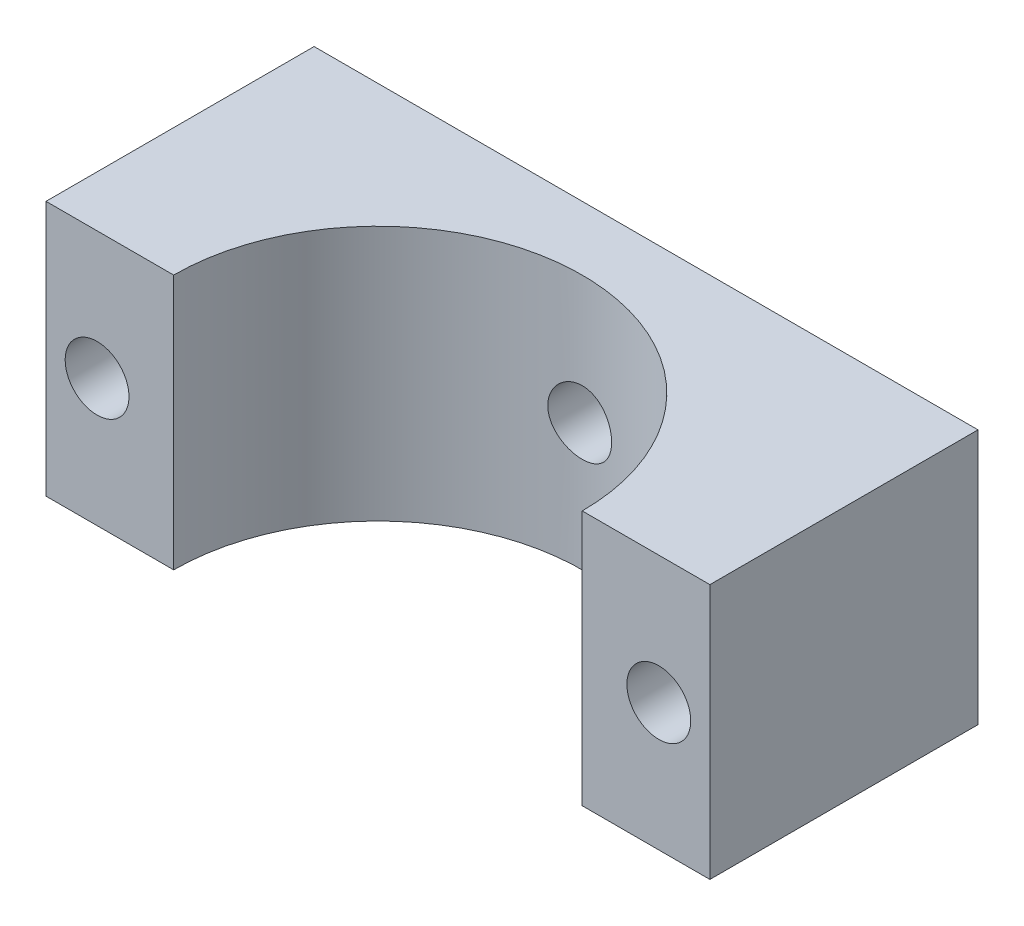
ISO-10303-21;
HEADER;
FILE_DESCRIPTION(('STEP AP214'),'2;1');
FILE_NAME('part.step','',(''),(''),'','','');
FILE_SCHEMA(('AUTOMOTIVE_DESIGN { 1 0 10303 214 1 1 1 1 }'));
ENDSEC;
DATA;
#1=APPLICATION_CONTEXT('core data for automotive mechanical design processes');
#2=APPLICATION_PROTOCOL_DEFINITION('international standard','automotive_design',2000,#1);
#3=PRODUCT_CONTEXT('',#1,'mechanical');
#4=PRODUCT('Part','Part','',(#3));
#5=PRODUCT_RELATED_PRODUCT_CATEGORY('part','',(#4));
#6=PRODUCT_DEFINITION_FORMATION('','',#4);
#7=PRODUCT_DEFINITION_CONTEXT('part definition',#1,'design');
#8=PRODUCT_DEFINITION('design','',#6,#7);
#9=PRODUCT_DEFINITION_SHAPE('','',#8);
#10=(LENGTH_UNIT() NAMED_UNIT(*) SI_UNIT(.MILLI.,.METRE.));
#11=(NAMED_UNIT(*) PLANE_ANGLE_UNIT() SI_UNIT($,.RADIAN.));
#12=(NAMED_UNIT(*) SI_UNIT($,.STERADIAN.) SOLID_ANGLE_UNIT());
#13=UNCERTAINTY_MEASURE_WITH_UNIT(LENGTH_MEASURE(1.E-05),#10,'distance_accuracy_value','');
#14=(GEOMETRIC_REPRESENTATION_CONTEXT(3) GLOBAL_UNCERTAINTY_ASSIGNED_CONTEXT((#13)) GLOBAL_UNIT_ASSIGNED_CONTEXT((#10,
#11,#12)) REPRESENTATION_CONTEXT('',''));
#15=CARTESIAN_POINT('',(0.,0.,0.));
#16=DIRECTION('',(0.,0.,1.));
#17=DIRECTION('',(1.,0.,0.));
#18=AXIS2_PLACEMENT_3D('',#15,#16,#17);
#19=CARTESIAN_POINT('',(0.,10.,0.));
#20=DIRECTION('',(0.,-1.,0.));
#21=DIRECTION('',(0.,0.,-1.));
#22=AXIS2_PLACEMENT_3D('',#19,#20,#21);
#23=CYLINDRICAL_SURFACE('',#22,8.);
#24=CARTESIAN_POINT('',(0.,6.25,-8.));
#25=CARTESIAN_POINT('',(0.0697575486355164,6.24999715086424,-7.99999885097242));
#26=CARTESIAN_POINT('',(0.139554702432852,6.24414094311322,-7.9990780624287));
#27=CARTESIAN_POINT('',(0.277195657489051,6.22087815436162,-7.99549349048796));
#28=CARTESIAN_POINT('',(0.345037530661658,6.20346055374825,-7.99282804422361));
#29=CARTESIAN_POINT('',(0.476756269023702,6.15761016859669,-7.98605348582888));
#30=CARTESIAN_POINT('',(0.540636176144951,6.1291859593192,-7.98194549781586));
#31=CARTESIAN_POINT('',(0.6627106255223,6.0621507274292,-7.97273897019077));
#32=CARTESIAN_POINT('',(0.720905905184154,6.02354102848203,-7.96764055931276));
#33=CARTESIAN_POINT('',(0.830459955825809,5.93688347582302,-7.95697134207178));
#34=CARTESIAN_POINT('',(0.881763739571322,5.88876650255488,-7.95139725696168));
#35=CARTESIAN_POINT('',(0.975603844114116,5.78460902586555,-7.94043038065143));
#36=CARTESIAN_POINT('',(1.01813964327096,5.7285680513499,-7.93503760025374));
#37=CARTESIAN_POINT('',(1.09345272164442,5.60978086432814,-7.92501214063723));
#38=CARTESIAN_POINT('',(1.12617636778996,5.5470002588191,-7.92038369893052));
#39=CARTESIAN_POINT('',(1.18059340798533,5.4167492945711,-7.91245600871182));
#40=CARTESIAN_POINT('',(1.20228745505032,5.34927921374472,-7.90915668151108));
#41=CARTESIAN_POINT('',(1.23385779661084,5.21214454942811,-7.90429317255518));
#42=CARTESIAN_POINT('',(1.24382852743748,5.1425022070906,-7.90271513266182));
#43=CARTESIAN_POINT('',(1.25196184878811,5.00251640555368,-7.90143085535887));
#44=CARTESIAN_POINT('',(1.25012517430233,4.93217299026698,-7.90172450144011));
#45=CARTESIAN_POINT('',(1.23477290404445,4.79345148407366,-7.90413775227603));
#46=CARTESIAN_POINT('',(1.22136281479847,4.72506138832343,-7.90624086092473));
#47=CARTESIAN_POINT('',(1.18340968916876,4.59151399682034,-7.91201028172736));
#48=CARTESIAN_POINT('',(1.15886631342066,4.52635679967973,-7.91567664153206));
#49=CARTESIAN_POINT('',(1.09923458474692,4.40080564366142,-7.92417753427311));
#50=CARTESIAN_POINT('',(1.06410186157774,4.34043310411347,-7.92901696543622));
#51=CARTESIAN_POINT('',(0.984320290733186,4.22640023215723,-7.93931523075049));
#52=CARTESIAN_POINT('',(0.939670766265083,4.17274037755627,-7.94477410894106));
#53=CARTESIAN_POINT('',(0.841545444111664,4.07304487668334,-7.95576893124448));
#54=CARTESIAN_POINT('',(0.787979002802695,4.02709842086527,-7.96130506817796));
#55=CARTESIAN_POINT('',(0.67384847368968,3.94483342718005,-7.97177562673913));
#56=CARTESIAN_POINT('',(0.613284350340659,3.90851493822159,-7.97671004531012));
#57=CARTESIAN_POINT('',(0.486797963528246,3.8465309632888,-7.98542699513518));
#58=CARTESIAN_POINT('',(0.42087209312023,3.8208727207335,-7.98920874270967));
#59=CARTESIAN_POINT('',(0.28557476734838,3.78101701627639,-7.99518780000339));
#60=CARTESIAN_POINT('',(0.2162035653436,3.76681871296676,-7.99738522604488));
#61=CARTESIAN_POINT('',(0.076754168381868,3.7504053617749,-7.99993255863639));
#62=CARTESIAN_POINT('',(0.00669073075435144,3.74806776051191,-8.0003013589643));
#63=CARTESIAN_POINT('',(-0.132827273205821,3.75511635266799,-7.99920143245634));
#64=CARTESIAN_POINT('',(-0.202281859962578,3.76450215129455,-7.99773276749821));
#65=CARTESIAN_POINT('',(-0.338236723132852,3.79462919384009,-7.99313461846611));
#66=CARTESIAN_POINT('',(-0.404750631028021,3.81531037913387,-7.99001392107693));
#67=CARTESIAN_POINT('',(-0.533367033928313,3.86737754719939,-7.98246037841779));
#68=CARTESIAN_POINT('',(-0.595469306519704,3.89876406922133,-7.97802746705036));
#69=CARTESIAN_POINT('',(-0.714036101125204,3.97163599556329,-7.96829486370472));
#70=CARTESIAN_POINT('',(-0.770452561891862,4.01319871004524,-7.9629886433171));
#71=CARTESIAN_POINT('',(-0.875553482539031,4.10513604295389,-7.95211940232218));
#72=CARTESIAN_POINT('',(-0.924237452235089,4.15551121960243,-7.94655636546338));
#73=CARTESIAN_POINT('',(-1.01294040388345,4.2641905986086,-7.93574013768325));
#74=CARTESIAN_POINT('',(-1.05287699292063,4.32256242356116,-7.93049020595401));
#75=CARTESIAN_POINT('',(-1.1223778386332,4.44525803683067,-7.92095346402914));
#76=CARTESIAN_POINT('',(-1.15194239389052,4.50958165374474,-7.91666662610998));
#77=CARTESIAN_POINT('',(-1.19973385972497,4.64211482035709,-7.90956535676178));
#78=CARTESIAN_POINT('',(-1.21800327473956,4.71030873438281,-7.9067454117448));
#79=CARTESIAN_POINT('',(-1.24282061020268,4.84884457183199,-7.90288285140397));
#80=CARTESIAN_POINT('',(-1.24936941542499,4.9191863327095,-7.9018401019222));
#81=CARTESIAN_POINT('',(-1.25053726345378,5.05919935795374,-7.90165529022442));
#82=CARTESIAN_POINT('',(-1.24528590274213,5.12886954846675,-7.90249258021451));
#83=CARTESIAN_POINT('',(-1.2232811162795,5.26632264857214,-7.90592849470915));
#84=CARTESIAN_POINT('',(-1.20652771543481,5.33410556225086,-7.90852711539975));
#85=CARTESIAN_POINT('',(-1.16204164945926,5.46581891332026,-7.91518544427452));
#86=CARTESIAN_POINT('',(-1.1343188086929,5.52975273912921,-7.91924384476704));
#87=CARTESIAN_POINT('',(-1.06869384273209,5.65208280683814,-7.92836592023698));
#88=CARTESIAN_POINT('',(-1.03079131410443,5.71047882914422,-7.93342963505413));
#89=CARTESIAN_POINT('',(-0.945415040695398,5.82073277206342,-7.9440578404613));
#90=CARTESIAN_POINT('',(-0.897845535473842,5.87251609830692,-7.94962700580145));
#91=CARTESIAN_POINT('',(-0.79468797319102,5.96741061819337,-7.96060021820367));
#92=CARTESIAN_POINT('',(-0.739098060392162,6.01051979929594,-7.96600422670061));
#93=CARTESIAN_POINT('',(-0.621083429421707,6.08707561151578,-7.9760755122835));
#94=CARTESIAN_POINT('',(-0.55861968607119,6.12046268637981,-7.98073817215134));
#95=CARTESIAN_POINT('',(-0.428925941178892,6.17622049809647,-7.9887562991944));
#96=CARTESIAN_POINT('',(-0.361700888290881,6.1986024862792,-7.9921131007106));
#97=CARTESIAN_POINT('',(-0.245157119955797,6.22671651054529,-7.9963872293244));
#98=CARTESIAN_POINT('',(-0.196552787825812,6.2354342453145,-7.99773495813061));
#99=CARTESIAN_POINT('',(-0.0986388989252906,6.24707695668954,-7.99954174348811));
#100=CARTESIAN_POINT('',(-0.0493293520845591,6.25000201477867,-8.00000081253982));
#101=CARTESIAN_POINT('',(0.,6.25,-8.));
#102=B_SPLINE_CURVE_WITH_KNOTS('',3,(#24,#25,#26,#27,#28,#29,#30,#31,#32,#33,#34,#35,#36,#37,
#38,#39,#40,#41,#42,#43,#44,#45,#46,#47,#48,#49,#50,#51,#52,#53,#54,#55,#56,#57,#58,#59,#60,#61,
#62,#63,#64,#65,#66,#67,#68,#69,#70,#71,#72,#73,#74,#75,#76,#77,#78,#79,#80,#81,#82,#83,#84,#85,
#86,#87,#88,#89,#90,#91,#92,#93,#94,#95,#96,#97,#98,#99,#100,#101),.UNSPECIFIED.,.T.,.F.,(4,2,2,
2,2,2,2,2,2,2,2,2,2,2,2,2,2,2,2,2,2,2,2,2,2,2,2,2,2,2,2,2,2,2,2,2,2,2,4),(0.,0.209092370238745,
0.418384321264007,0.627513539720514,0.83661559396015,1.047297840761,1.25799261822711,
1.4698188930288,1.68163262504619,1.89172815567497,2.10181060835272,2.3099978801129,
2.51819149825525,2.72726988701174,2.93636314946034,3.14772866167183,3.35909524756914,
3.57060521877282,3.78209965914933,3.99140427002957,4.20070183264178,4.40889722378283,
4.61710310371015,4.82694270734836,5.03679560800708,5.24854740124796,5.46029309824491,
5.67123705197566,5.88216508114648,6.09078790799346,6.29941028309448,6.50784623483309,
6.71629044835674,6.92691006157771,7.1375784857115,7.34951152099921,7.5612274282814,
7.7090900817577,7.85695065529355),.UNSPECIFIED.);
#103=CARTESIAN_POINT('',(0.,6.25,-8.));
#104=VERTEX_POINT('',#103);
#105=EDGE_CURVE('E168',#104,#104,#102,.T.);
#106=ORIENTED_EDGE('',*,*,#105,.T.);
#107=EDGE_LOOP('',(#106));
#108=FACE_BOUND('',#107,.T.);
#109=CARTESIAN_POINT('',(0.,0.,0.));
#110=DIRECTION('',(0.,-1.,0.));
#111=DIRECTION('',(0.,0.,1.));
#112=AXIS2_PLACEMENT_3D('',#109,#110,#111);
#113=CIRCLE('',#112,8.);
#114=CARTESIAN_POINT('',(-8.,0.,0.));
#115=VERTEX_POINT('',#114);
#116=CARTESIAN_POINT('',(8.,0.,0.));
#117=VERTEX_POINT('',#116);
#118=EDGE_CURVE('E122',#115,#117,#113,.T.);
#119=ORIENTED_EDGE('',*,*,#118,.T.);
#120=DIRECTION('',(0.,-1.,0.));
#121=VECTOR('',#120,1.);
#122=CARTESIAN_POINT('',(8.,10.,0.));
#123=LINE('',#122,#121);
#124=CARTESIAN_POINT('',(8.,10.,0.));
#125=VERTEX_POINT('',#124);
#126=EDGE_CURVE('E11',#125,#117,#123,.T.);
#127=ORIENTED_EDGE('',*,*,#126,.F.);
#128=CARTESIAN_POINT('',(0.,10.,0.));
#129=DIRECTION('',(0.,-1.,0.));
#130=DIRECTION('',(0.,0.,1.));
#131=AXIS2_PLACEMENT_3D('',#128,#129,#130);
#132=CIRCLE('',#131,8.);
#133=CARTESIAN_POINT('',(-8.,10.,0.));
#134=VERTEX_POINT('',#133);
#135=EDGE_CURVE('E133',#134,#125,#132,.T.);
#136=ORIENTED_EDGE('',*,*,#135,.F.);
#137=DIRECTION('',(0.,-1.,0.));
#138=VECTOR('',#137,1.);
#139=CARTESIAN_POINT('',(-8.,10.,0.));
#140=LINE('',#139,#138);
#141=EDGE_CURVE('E118',#134,#115,#140,.T.);
#142=ORIENTED_EDGE('',*,*,#141,.T.);
#143=EDGE_LOOP('',(#119,#127,#136,#142));
#144=FACE_BOUND('',#143,.T.);
#145=ADVANCED_FACE('F36',(#108,#144),#23,.F.);
#146=CARTESIAN_POINT('',(8.,10.,0.));
#147=DIRECTION('',(0.,0.,-1.));
#148=DIRECTION('',(-1.,0.,0.));
#149=AXIS2_PLACEMENT_3D('',#146,#147,#148);
#150=PLANE('',#149);
#151=CARTESIAN_POINT('',(11.,5.,0.));
#152=DIRECTION('',(0.,0.,-1.));
#153=DIRECTION('',(-1.,0.,0.));
#154=AXIS2_PLACEMENT_3D('',#151,#152,#153);
#155=CIRCLE('',#154,1.25);
#156=CARTESIAN_POINT('',(9.75,5.,0.));
#157=VERTEX_POINT('',#156);
#158=EDGE_CURVE('E126',#157,#157,#155,.T.);
#159=ORIENTED_EDGE('',*,*,#158,.T.);
#160=EDGE_LOOP('',(#159));
#161=FACE_BOUND('',#160,.T.);
#162=DIRECTION('',(1.,0.,0.));
#163=VECTOR('',#162,1.);
#164=CARTESIAN_POINT('',(8.,0.,0.));
#165=LINE('',#164,#163);
#166=CARTESIAN_POINT('',(13.,0.,0.));
#167=VERTEX_POINT('',#166);
#168=EDGE_CURVE('E125',#117,#167,#165,.T.);
#169=ORIENTED_EDGE('',*,*,#168,.T.);
#170=DIRECTION('',(0.,-1.,0.));
#171=VECTOR('',#170,1.);
#172=CARTESIAN_POINT('',(13.,10.,0.));
#173=LINE('',#172,#171);
#174=CARTESIAN_POINT('',(13.,10.,0.));
#175=VERTEX_POINT('',#174);
#176=EDGE_CURVE('E46',#175,#167,#173,.T.);
#177=ORIENTED_EDGE('',*,*,#176,.F.);
#178=DIRECTION('',(1.,0.,0.));
#179=VECTOR('',#178,1.);
#180=CARTESIAN_POINT('',(8.,10.,0.));
#181=LINE('',#180,#179);
#182=EDGE_CURVE('E91',#125,#175,#181,.T.);
#183=ORIENTED_EDGE('',*,*,#182,.F.);
#184=ORIENTED_EDGE('',*,*,#126,.T.);
#185=EDGE_LOOP('',(#169,#177,#183,#184));
#186=FACE_BOUND('',#185,.T.);
#187=ADVANCED_FACE('F160',(#161,#186),#150,.F.);
#188=CARTESIAN_POINT('',(13.,10.,0.));
#189=DIRECTION('',(-1.,0.,0.));
#190=DIRECTION('',(0.,0.,1.));
#191=AXIS2_PLACEMENT_3D('',#188,#189,#190);
#192=PLANE('',#191);
#193=DIRECTION('',(0.,0.,-1.));
#194=VECTOR('',#193,1.);
#195=CARTESIAN_POINT('',(13.,0.,0.));
#196=LINE('',#195,#194);
#197=CARTESIAN_POINT('',(13.,0.,-10.5));
#198=VERTEX_POINT('',#197);
#199=EDGE_CURVE('E128',#167,#198,#196,.T.);
#200=ORIENTED_EDGE('',*,*,#199,.T.);
#201=DIRECTION('',(0.,-1.,0.));
#202=VECTOR('',#201,1.);
#203=CARTESIAN_POINT('',(13.,10.,-10.5));
#204=LINE('',#203,#202);
#205=CARTESIAN_POINT('',(13.,10.,-10.5));
#206=VERTEX_POINT('',#205);
#207=EDGE_CURVE('E113',#206,#198,#204,.T.);
#208=ORIENTED_EDGE('',*,*,#207,.F.);
#209=DIRECTION('',(0.,0.,-1.));
#210=VECTOR('',#209,1.);
#211=CARTESIAN_POINT('',(13.,10.,0.));
#212=LINE('',#211,#210);
#213=EDGE_CURVE('E104',#175,#206,#212,.T.);
#214=ORIENTED_EDGE('',*,*,#213,.F.);
#215=ORIENTED_EDGE('',*,*,#176,.T.);
#216=EDGE_LOOP('',(#200,#208,#214,#215));
#217=FACE_BOUND('',#216,.T.);
#218=ADVANCED_FACE('F140',(#217),#192,.F.);
#219=CARTESIAN_POINT('',(-13.,10.,-10.5));
#220=DIRECTION('',(0.,0.,1.));
#221=DIRECTION('',(1.,0.,0.));
#222=AXIS2_PLACEMENT_3D('',#219,#220,#221);
#223=PLANE('',#222);
#224=CARTESIAN_POINT('',(11.,5.,-10.5));
#225=DIRECTION('',(0.,0.,-1.));
#226=DIRECTION('',(-1.,0.,0.));
#227=AXIS2_PLACEMENT_3D('',#224,#225,#226);
#228=CIRCLE('',#227,1.25);
#229=CARTESIAN_POINT('',(9.75,5.,-10.5));
#230=VERTEX_POINT('',#229);
#231=EDGE_CURVE('E173',#230,#230,#228,.T.);
#232=ORIENTED_EDGE('',*,*,#231,.F.);
#233=EDGE_LOOP('',(#232));
#234=FACE_BOUND('',#233,.T.);
#235=CARTESIAN_POINT('',(0.,5.,-10.5));
#236=DIRECTION('',(0.,0.,-1.));
#237=DIRECTION('',(-1.,0.,0.));
#238=AXIS2_PLACEMENT_3D('',#235,#236,#237);
#239=CIRCLE('',#238,1.25);
#240=CARTESIAN_POINT('',(-1.25,5.,-10.5));
#241=VERTEX_POINT('',#240);
#242=EDGE_CURVE('E268',#241,#241,#239,.T.);
#243=ORIENTED_EDGE('',*,*,#242,.F.);
#244=EDGE_LOOP('',(#243));
#245=FACE_BOUND('',#244,.T.);
#246=CARTESIAN_POINT('',(-11.,5.,-10.5));
#247=DIRECTION('',(0.,0.,-1.));
#248=DIRECTION('',(1.,0.,0.));
#249=AXIS2_PLACEMENT_3D('',#246,#247,#248);
#250=CIRCLE('',#249,1.25);
#251=CARTESIAN_POINT('',(-9.75,5.,-10.5));
#252=VERTEX_POINT('',#251);
#253=EDGE_CURVE('E179',#252,#252,#250,.T.);
#254=ORIENTED_EDGE('',*,*,#253,.F.);
#255=EDGE_LOOP('',(#254));
#256=FACE_BOUND('',#255,.T.);
#257=DIRECTION('',(-1.,0.,0.));
#258=VECTOR('',#257,1.);
#259=CARTESIAN_POINT('',(-13.,0.,-10.5));
#260=LINE('',#259,#258);
#261=CARTESIAN_POINT('',(-13.,0.,-10.5));
#262=VERTEX_POINT('',#261);
#263=EDGE_CURVE('E112',#198,#262,#260,.T.);
#264=ORIENTED_EDGE('',*,*,#263,.T.);
#265=DIRECTION('',(0.,-1.,0.));
#266=VECTOR('',#265,1.);
#267=CARTESIAN_POINT('',(-13.,10.,-10.5));
#268=LINE('',#267,#266);
#269=CARTESIAN_POINT('',(-13.,10.,-10.5));
#270=VERTEX_POINT('',#269);
#271=EDGE_CURVE('E109',#270,#262,#268,.T.);
#272=ORIENTED_EDGE('',*,*,#271,.F.);
#273=DIRECTION('',(-1.,0.,0.));
#274=VECTOR('',#273,1.);
#275=CARTESIAN_POINT('',(-13.,10.,-10.5));
#276=LINE('',#275,#274);
#277=EDGE_CURVE('E98',#206,#270,#276,.T.);
#278=ORIENTED_EDGE('',*,*,#277,.F.);
#279=ORIENTED_EDGE('',*,*,#207,.T.);
#280=EDGE_LOOP('',(#264,#272,#278,#279));
#281=FACE_BOUND('',#280,.T.);
#282=ADVANCED_FACE('F110',(#234,#245,#256,#281),#223,.F.);
#283=CARTESIAN_POINT('',(-13.,10.,0.));
#284=DIRECTION('',(1.,0.,0.));
#285=DIRECTION('',(0.,0.,-1.));
#286=AXIS2_PLACEMENT_3D('',#283,#284,#285);
#287=PLANE('',#286);
#288=DIRECTION('',(0.,0.,1.));
#289=VECTOR('',#288,1.);
#290=CARTESIAN_POINT('',(-13.,0.,0.));
#291=LINE('',#290,#289);
#292=CARTESIAN_POINT('',(-13.,0.,0.));
#293=VERTEX_POINT('',#292);
#294=EDGE_CURVE('E77',#262,#293,#291,.T.);
#295=ORIENTED_EDGE('',*,*,#294,.T.);
#296=DIRECTION('',(0.,-1.,0.));
#297=VECTOR('',#296,1.);
#298=CARTESIAN_POINT('',(-13.,10.,0.));
#299=LINE('',#298,#297);
#300=CARTESIAN_POINT('',(-13.,10.,0.));
#301=VERTEX_POINT('',#300);
#302=EDGE_CURVE('E114',#301,#293,#299,.T.);
#303=ORIENTED_EDGE('',*,*,#302,.F.);
#304=DIRECTION('',(0.,0.,1.));
#305=VECTOR('',#304,1.);
#306=CARTESIAN_POINT('',(-13.,10.,0.));
#307=LINE('',#306,#305);
#308=EDGE_CURVE('E102',#270,#301,#307,.T.);
#309=ORIENTED_EDGE('',*,*,#308,.F.);
#310=ORIENTED_EDGE('',*,*,#271,.T.);
#311=EDGE_LOOP('',(#295,#303,#309,#310));
#312=FACE_BOUND('',#311,.T.);
#313=ADVANCED_FACE('F116',(#312),#287,.F.);
#314=CARTESIAN_POINT('',(-8.,10.,0.));
#315=DIRECTION('',(0.,0.,-1.));
#316=DIRECTION('',(-1.,0.,0.));
#317=AXIS2_PLACEMENT_3D('',#314,#315,#316);
#318=PLANE('',#317);
#319=CARTESIAN_POINT('',(-11.,5.,0.));
#320=DIRECTION('',(0.,0.,-1.));
#321=DIRECTION('',(-1.,0.,0.));
#322=AXIS2_PLACEMENT_3D('',#319,#320,#321);
#323=CIRCLE('',#322,1.25);
#324=CARTESIAN_POINT('',(-12.25,5.,0.));
#325=VERTEX_POINT('',#324);
#326=EDGE_CURVE('E40',#325,#325,#323,.T.);
#327=ORIENTED_EDGE('',*,*,#326,.T.);
#328=EDGE_LOOP('',(#327));
#329=FACE_BOUND('',#328,.T.);
#330=DIRECTION('',(1.,0.,0.));
#331=VECTOR('',#330,1.);
#332=CARTESIAN_POINT('',(-8.,0.,0.));
#333=LINE('',#332,#331);
#334=EDGE_CURVE('E83',#293,#115,#333,.T.);
#335=ORIENTED_EDGE('',*,*,#334,.T.);
#336=ORIENTED_EDGE('',*,*,#141,.F.);
#337=DIRECTION('',(1.,0.,0.));
#338=VECTOR('',#337,1.);
#339=CARTESIAN_POINT('',(-8.,10.,0.));
#340=LINE('',#339,#338);
#341=EDGE_CURVE('E54',#301,#134,#340,.T.);
#342=ORIENTED_EDGE('',*,*,#341,.F.);
#343=ORIENTED_EDGE('',*,*,#302,.T.);
#344=EDGE_LOOP('',(#335,#336,#342,#343));
#345=FACE_BOUND('',#344,.T.);
#346=ADVANCED_FACE('F147',(#329,#345),#318,.F.);
#347=CARTESIAN_POINT('',(0.,10.,0.));
#348=DIRECTION('',(0.,1.,0.));
#349=DIRECTION('',(0.,0.,1.));
#350=AXIS2_PLACEMENT_3D('',#347,#348,#349);
#351=PLANE('',#350);
#352=ORIENTED_EDGE('',*,*,#135,.T.);
#353=ORIENTED_EDGE('',*,*,#182,.T.);
#354=ORIENTED_EDGE('',*,*,#213,.T.);
#355=ORIENTED_EDGE('',*,*,#277,.T.);
#356=ORIENTED_EDGE('',*,*,#308,.T.);
#357=ORIENTED_EDGE('',*,*,#341,.T.);
#358=EDGE_LOOP('',(#352,#353,#354,#355,#356,#357));
#359=FACE_BOUND('',#358,.T.);
#360=ADVANCED_FACE('F100',(#359),#351,.T.);
#361=CARTESIAN_POINT('',(0.,0.,0.));
#362=DIRECTION('',(0.,1.,0.));
#363=DIRECTION('',(0.,0.,1.));
#364=AXIS2_PLACEMENT_3D('',#361,#362,#363);
#365=PLANE('',#364);
#366=ORIENTED_EDGE('',*,*,#118,.F.);
#367=ORIENTED_EDGE('',*,*,#334,.F.);
#368=ORIENTED_EDGE('',*,*,#294,.F.);
#369=ORIENTED_EDGE('',*,*,#263,.F.);
#370=ORIENTED_EDGE('',*,*,#199,.F.);
#371=ORIENTED_EDGE('',*,*,#168,.F.);
#372=EDGE_LOOP('',(#366,#367,#368,#369,#370,#371));
#373=FACE_BOUND('',#372,.T.);
#374=ADVANCED_FACE('F143',(#373),#365,.F.);
#375=CARTESIAN_POINT('',(-11.,5.,2.5));
#376=DIRECTION('',(0.,0.,-1.));
#377=DIRECTION('',(-1.,0.,0.));
#378=AXIS2_PLACEMENT_3D('',#375,#376,#377);
#379=CYLINDRICAL_SURFACE('',#378,1.25);
#380=ORIENTED_EDGE('',*,*,#253,.T.);
#381=EDGE_LOOP('',(#380));
#382=FACE_BOUND('',#381,.T.);
#383=ORIENTED_EDGE('',*,*,#326,.F.);
#384=EDGE_LOOP('',(#383));
#385=FACE_BOUND('',#384,.T.);
#386=ADVANCED_FACE('F188',(#382,#385),#379,.F.);
#387=CARTESIAN_POINT('',(0.,5.,2.5));
#388=DIRECTION('',(0.,0.,-1.));
#389=DIRECTION('',(-1.,0.,0.));
#390=AXIS2_PLACEMENT_3D('',#387,#388,#389);
#391=CYLINDRICAL_SURFACE('',#390,1.25);
#392=ORIENTED_EDGE('',*,*,#242,.T.);
#393=EDGE_LOOP('',(#392));
#394=FACE_BOUND('',#393,.T.);
#395=ORIENTED_EDGE('',*,*,#105,.F.);
#396=EDGE_LOOP('',(#395));
#397=FACE_BOUND('',#396,.T.);
#398=ADVANCED_FACE('F182',(#394,#397),#391,.F.);
#399=CARTESIAN_POINT('',(11.,5.,2.5));
#400=DIRECTION('',(0.,0.,-1.));
#401=DIRECTION('',(-1.,0.,0.));
#402=AXIS2_PLACEMENT_3D('',#399,#400,#401);
#403=CYLINDRICAL_SURFACE('',#402,1.25);
#404=ORIENTED_EDGE('',*,*,#231,.T.);
#405=EDGE_LOOP('',(#404));
#406=FACE_BOUND('',#405,.T.);
#407=ORIENTED_EDGE('',*,*,#158,.F.);
#408=EDGE_LOOP('',(#407));
#409=FACE_BOUND('',#408,.T.);
#410=ADVANCED_FACE('F187',(#406,#409),#403,.F.);
#411=CLOSED_SHELL('',(#145,#187,#218,#282,#313,#346,#360,#374,#386,#398,#410));
#412=MANIFOLD_SOLID_BREP('B2',#411);
#413=ADVANCED_BREP_SHAPE_REPRESENTATION('',(#18,#412),#14);
#414=SHAPE_DEFINITION_REPRESENTATION(#9,#413);
ENDSEC;
END-ISO-10303-21;
